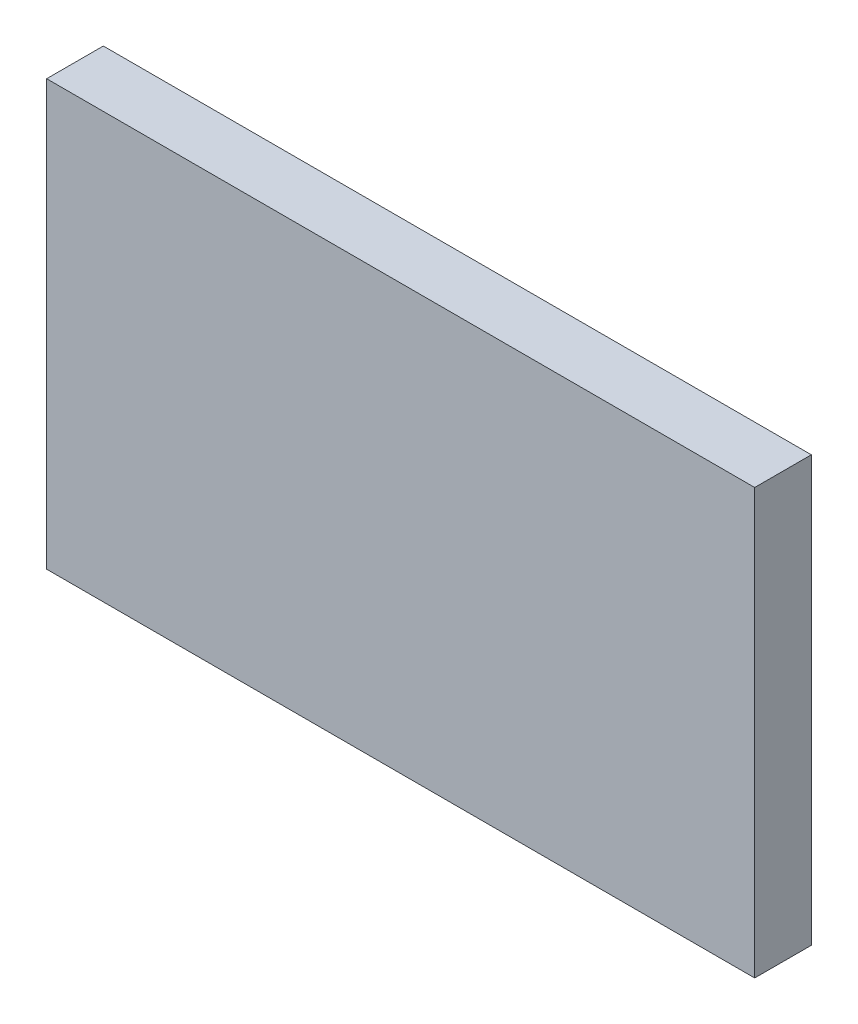
ISO-10303-21;
HEADER;
FILE_DESCRIPTION(('STEP AP214'),'2;1');
FILE_NAME('part.step','',(''),(''),'','','');
FILE_SCHEMA(('AUTOMOTIVE_DESIGN { 1 0 10303 214 1 1 1 1 }'));
ENDSEC;
DATA;
#1=APPLICATION_CONTEXT('core data for automotive mechanical design processes');
#2=APPLICATION_PROTOCOL_DEFINITION('international standard','automotive_design',2000,#1);
#3=PRODUCT_CONTEXT('',#1,'mechanical');
#4=PRODUCT('Part','Part','',(#3));
#5=PRODUCT_RELATED_PRODUCT_CATEGORY('part','',(#4));
#6=PRODUCT_DEFINITION_FORMATION('','',#4);
#7=PRODUCT_DEFINITION_CONTEXT('part definition',#1,'design');
#8=PRODUCT_DEFINITION('design','',#6,#7);
#9=PRODUCT_DEFINITION_SHAPE('','',#8);
#10=(LENGTH_UNIT() NAMED_UNIT(*) SI_UNIT(.MILLI.,.METRE.));
#11=(NAMED_UNIT(*) PLANE_ANGLE_UNIT() SI_UNIT($,.RADIAN.));
#12=(NAMED_UNIT(*) SI_UNIT($,.STERADIAN.) SOLID_ANGLE_UNIT());
#13=UNCERTAINTY_MEASURE_WITH_UNIT(LENGTH_MEASURE(1.E-05),#10,'distance_accuracy_value','');
#14=(GEOMETRIC_REPRESENTATION_CONTEXT(3) GLOBAL_UNCERTAINTY_ASSIGNED_CONTEXT((#13)) GLOBAL_UNIT_ASSIGNED_CONTEXT((#10,
#11,#12)) REPRESENTATION_CONTEXT('',''));
#15=CARTESIAN_POINT('',(0.,0.,0.));
#16=DIRECTION('',(0.,0.,1.));
#17=DIRECTION('',(1.,0.,0.));
#18=AXIS2_PLACEMENT_3D('',#15,#16,#17);
#19=CARTESIAN_POINT('',(0.,0.,400.));
#20=DIRECTION('',(1.,0.,0.));
#21=DIRECTION('',(0.,0.,-1.));
#22=AXIS2_PLACEMENT_3D('',#19,#20,#21);
#23=PLANE('',#22);
#24=DIRECTION('',(0.,-1.,0.));
#25=VECTOR('',#24,1.);
#26=CARTESIAN_POINT('',(0.,0.,0.));
#27=LINE('',#26,#25);
#28=CARTESIAN_POINT('',(0.,3000.,0.));
#29=VERTEX_POINT('',#28);
#30=CARTESIAN_POINT('',(0.,0.,0.));
#31=VERTEX_POINT('',#30);
#32=EDGE_CURVE('E75',#29,#31,#27,.T.);
#33=ORIENTED_EDGE('',*,*,#32,.T.);
#34=DIRECTION('',(0.,0.,-1.));
#35=VECTOR('',#34,1.);
#36=CARTESIAN_POINT('',(0.,0.,400.));
#37=LINE('',#36,#35);
#38=CARTESIAN_POINT('',(0.,0.,400.));
#39=VERTEX_POINT('',#38);
#40=EDGE_CURVE('E11',#39,#31,#37,.T.);
#41=ORIENTED_EDGE('',*,*,#40,.F.);
#42=DIRECTION('',(0.,-1.,0.));
#43=VECTOR('',#42,1.);
#44=CARTESIAN_POINT('',(0.,0.,400.));
#45=LINE('',#44,#43);
#46=CARTESIAN_POINT('',(0.,3000.,400.));
#47=VERTEX_POINT('',#46);
#48=EDGE_CURVE('E93',#47,#39,#45,.T.);
#49=ORIENTED_EDGE('',*,*,#48,.F.);
#50=DIRECTION('',(0.,0.,-1.));
#51=VECTOR('',#50,1.);
#52=CARTESIAN_POINT('',(0.,3000.,400.));
#53=LINE('',#52,#51);
#54=EDGE_CURVE('E87',#47,#29,#53,.T.);
#55=ORIENTED_EDGE('',*,*,#54,.T.);
#56=EDGE_LOOP('',(#33,#41,#49,#55));
#57=FACE_BOUND('',#56,.T.);
#58=ADVANCED_FACE('F31',(#57),#23,.F.);
#59=CARTESIAN_POINT('',(0.,0.,400.));
#60=DIRECTION('',(0.,1.,0.));
#61=DIRECTION('',(0.,0.,1.));
#62=AXIS2_PLACEMENT_3D('',#59,#60,#61);
#63=PLANE('',#62);
#64=DIRECTION('',(1.,0.,0.));
#65=VECTOR('',#64,1.);
#66=CARTESIAN_POINT('',(0.,0.,0.));
#67=LINE('',#66,#65);
#68=CARTESIAN_POINT('',(5000.,0.,0.));
#69=VERTEX_POINT('',#68);
#70=EDGE_CURVE('E71',#31,#69,#67,.T.);
#71=ORIENTED_EDGE('',*,*,#70,.T.);
#72=DIRECTION('',(0.,0.,-1.));
#73=VECTOR('',#72,1.);
#74=CARTESIAN_POINT('',(5000.,0.,400.));
#75=LINE('',#74,#73);
#76=CARTESIAN_POINT('',(5000.,0.,400.));
#77=VERTEX_POINT('',#76);
#78=EDGE_CURVE('E38',#77,#69,#75,.T.);
#79=ORIENTED_EDGE('',*,*,#78,.F.);
#80=DIRECTION('',(1.,0.,0.));
#81=VECTOR('',#80,1.);
#82=CARTESIAN_POINT('',(0.,0.,400.));
#83=LINE('',#82,#81);
#84=EDGE_CURVE('E83',#39,#77,#83,.T.);
#85=ORIENTED_EDGE('',*,*,#84,.F.);
#86=ORIENTED_EDGE('',*,*,#40,.T.);
#87=EDGE_LOOP('',(#71,#79,#85,#86));
#88=FACE_BOUND('',#87,.T.);
#89=ADVANCED_FACE('F82',(#88),#63,.F.);
#90=CARTESIAN_POINT('',(5000.,0.,400.));
#91=DIRECTION('',(-1.,0.,0.));
#92=DIRECTION('',(0.,0.,1.));
#93=AXIS2_PLACEMENT_3D('',#90,#91,#92);
#94=PLANE('',#93);
#95=DIRECTION('',(0.,1.,0.));
#96=VECTOR('',#95,1.);
#97=CARTESIAN_POINT('',(5000.,0.,0.));
#98=LINE('',#97,#96);
#99=CARTESIAN_POINT('',(5000.,3000.,0.));
#100=VERTEX_POINT('',#99);
#101=EDGE_CURVE('E76',#69,#100,#98,.T.);
#102=ORIENTED_EDGE('',*,*,#101,.T.);
#103=DIRECTION('',(0.,0.,-1.));
#104=VECTOR('',#103,1.);
#105=CARTESIAN_POINT('',(5000.,3000.,400.));
#106=LINE('',#105,#104);
#107=CARTESIAN_POINT('',(5000.,3000.,400.));
#108=VERTEX_POINT('',#107);
#109=EDGE_CURVE('E99',#108,#100,#106,.T.);
#110=ORIENTED_EDGE('',*,*,#109,.F.);
#111=DIRECTION('',(0.,1.,0.));
#112=VECTOR('',#111,1.);
#113=CARTESIAN_POINT('',(5000.,0.,400.));
#114=LINE('',#113,#112);
#115=EDGE_CURVE('E50',#77,#108,#114,.T.);
#116=ORIENTED_EDGE('',*,*,#115,.F.);
#117=ORIENTED_EDGE('',*,*,#78,.T.);
#118=EDGE_LOOP('',(#102,#110,#116,#117));
#119=FACE_BOUND('',#118,.T.);
#120=ADVANCED_FACE('F102',(#119),#94,.F.);
#121=CARTESIAN_POINT('',(0.,3000.,400.));
#122=DIRECTION('',(0.,-1.,0.));
#123=DIRECTION('',(0.,0.,-1.));
#124=AXIS2_PLACEMENT_3D('',#121,#122,#123);
#125=PLANE('',#124);
#126=DIRECTION('',(-1.,0.,0.));
#127=VECTOR('',#126,1.);
#128=CARTESIAN_POINT('',(0.,3000.,0.));
#129=LINE('',#128,#127);
#130=EDGE_CURVE('E91',#100,#29,#129,.T.);
#131=ORIENTED_EDGE('',*,*,#130,.T.);
#132=ORIENTED_EDGE('',*,*,#54,.F.);
#133=DIRECTION('',(-1.,0.,0.));
#134=VECTOR('',#133,1.);
#135=CARTESIAN_POINT('',(0.,3000.,400.));
#136=LINE('',#135,#134);
#137=EDGE_CURVE('E45',#108,#47,#136,.T.);
#138=ORIENTED_EDGE('',*,*,#137,.F.);
#139=ORIENTED_EDGE('',*,*,#109,.T.);
#140=EDGE_LOOP('',(#131,#132,#138,#139));
#141=FACE_BOUND('',#140,.T.);
#142=ADVANCED_FACE('F104',(#141),#125,.F.);
#143=CARTESIAN_POINT('',(0.,3000.,400.));
#144=DIRECTION('',(0.,0.,-1.));
#145=DIRECTION('',(-1.,0.,0.));
#146=AXIS2_PLACEMENT_3D('',#143,#144,#145);
#147=PLANE('',#146);
#148=ORIENTED_EDGE('',*,*,#48,.T.);
#149=ORIENTED_EDGE('',*,*,#84,.T.);
#150=ORIENTED_EDGE('',*,*,#115,.T.);
#151=ORIENTED_EDGE('',*,*,#137,.T.);
#152=EDGE_LOOP('',(#148,#149,#150,#151));
#153=FACE_BOUND('',#152,.T.);
#154=ADVANCED_FACE('F105',(#153),#147,.F.);
#155=CARTESIAN_POINT('',(0.,3000.,0.));
#156=DIRECTION('',(0.,0.,-1.));
#157=DIRECTION('',(-1.,0.,0.));
#158=AXIS2_PLACEMENT_3D('',#155,#156,#157);
#159=PLANE('',#158);
#160=ORIENTED_EDGE('',*,*,#32,.F.);
#161=ORIENTED_EDGE('',*,*,#130,.F.);
#162=ORIENTED_EDGE('',*,*,#101,.F.);
#163=ORIENTED_EDGE('',*,*,#70,.F.);
#164=EDGE_LOOP('',(#160,#161,#162,#163));
#165=FACE_BOUND('',#164,.T.);
#166=ADVANCED_FACE('F72',(#165),#159,.T.);
#167=CLOSED_SHELL('',(#58,#89,#120,#142,#154,#166));
#168=MANIFOLD_SOLID_BREP('B2',#167);
#169=ADVANCED_BREP_SHAPE_REPRESENTATION('',(#18,#168),#14);
#170=SHAPE_DEFINITION_REPRESENTATION(#9,#169);
ENDSEC;
END-ISO-10303-21;
